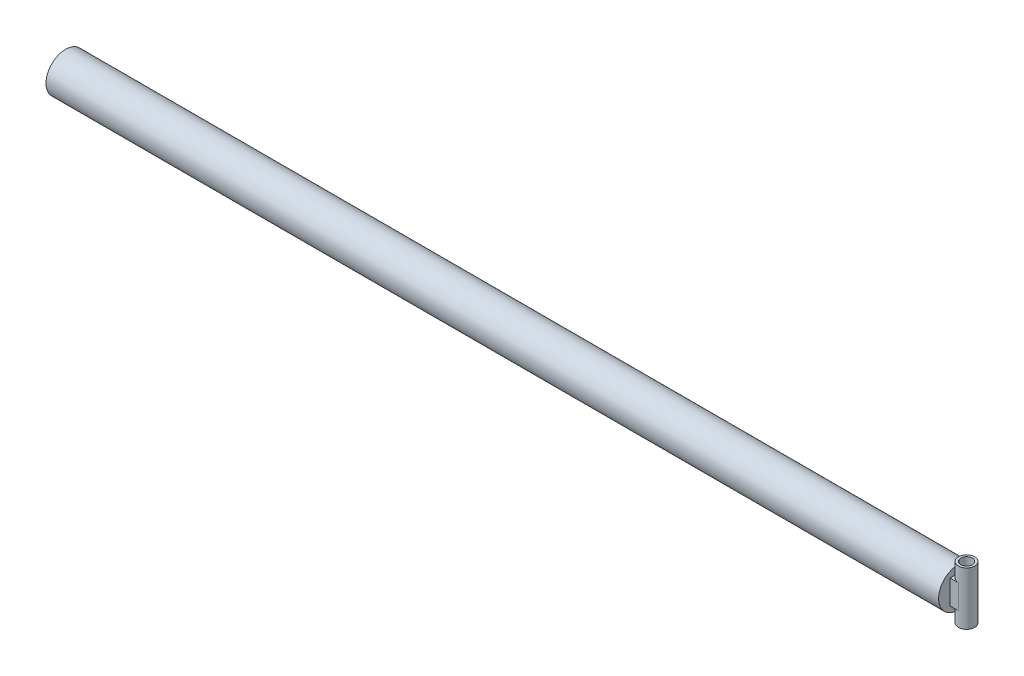
ISO-10303-21;
HEADER;
FILE_DESCRIPTION(('STEP AP214'),'2;1');
FILE_NAME('part.step','',(''),(''),'','','');
FILE_SCHEMA(('AUTOMOTIVE_DESIGN { 1 0 10303 214 1 1 1 1 }'));
ENDSEC;
DATA;
#1=APPLICATION_CONTEXT('core data for automotive mechanical design processes');
#2=APPLICATION_PROTOCOL_DEFINITION('international standard','automotive_design',2000,#1);
#3=PRODUCT_CONTEXT('',#1,'mechanical');
#4=PRODUCT('Part','Part','',(#3));
#5=PRODUCT_RELATED_PRODUCT_CATEGORY('part','',(#4));
#6=PRODUCT_DEFINITION_FORMATION('','',#4);
#7=PRODUCT_DEFINITION_CONTEXT('part definition',#1,'design');
#8=PRODUCT_DEFINITION('design','',#6,#7);
#9=PRODUCT_DEFINITION_SHAPE('','',#8);
#10=(LENGTH_UNIT() NAMED_UNIT(*) SI_UNIT(.MILLI.,.METRE.));
#11=(NAMED_UNIT(*) PLANE_ANGLE_UNIT() SI_UNIT($,.RADIAN.));
#12=(NAMED_UNIT(*) SI_UNIT($,.STERADIAN.) SOLID_ANGLE_UNIT());
#13=UNCERTAINTY_MEASURE_WITH_UNIT(LENGTH_MEASURE(1.E-05),#10,'distance_accuracy_value','');
#14=(GEOMETRIC_REPRESENTATION_CONTEXT(3) GLOBAL_UNCERTAINTY_ASSIGNED_CONTEXT((#13)) GLOBAL_UNIT_ASSIGNED_CONTEXT((#10,
#11,#12)) REPRESENTATION_CONTEXT('',''));
#15=CARTESIAN_POINT('',(0.,0.,0.));
#16=DIRECTION('',(0.,0.,1.));
#17=DIRECTION('',(1.,0.,0.));
#18=AXIS2_PLACEMENT_3D('',#15,#16,#17);
#19=CARTESIAN_POINT('',(1930.,0.,0.));
#20=DIRECTION('',(-1.,0.,0.));
#21=DIRECTION('',(0.,0.,1.));
#22=AXIS2_PLACEMENT_3D('',#19,#20,#21);
#23=PLANE('',#22);
#24=CARTESIAN_POINT('',(1930.,0.,0.));
#25=DIRECTION('',(1.,0.,0.));
#26=DIRECTION('',(0.,0.,-1.));
#27=AXIS2_PLACEMENT_3D('',#24,#25,#26);
#28=CIRCLE('',#27,84.9999999999995);
#29=CARTESIAN_POINT('',(1930.,0.,-84.9999999999995));
#30=VERTEX_POINT('',#29);
#31=EDGE_CURVE('E113',#30,#30,#28,.T.);
#32=ORIENTED_EDGE('',*,*,#31,.T.);
#33=EDGE_LOOP('',(#32));
#34=FACE_BOUND('',#33,.T.);
#35=DIRECTION('',(0.,0.,1.));
#36=VECTOR('',#35,1.);
#37=CARTESIAN_POINT('',(1930.,52.5,-35.));
#38=LINE('',#37,#36);
#39=CARTESIAN_POINT('',(1930.,52.5,-35.));
#40=VERTEX_POINT('',#39);
#41=CARTESIAN_POINT('',(1930.,52.5,35.));
#42=VERTEX_POINT('',#41);
#43=EDGE_CURVE('E61',#40,#42,#38,.T.);
#44=ORIENTED_EDGE('',*,*,#43,.F.);
#45=DIRECTION('',(0.,1.,0.));
#46=VECTOR('',#45,1.);
#47=CARTESIAN_POINT('',(1930.,52.5,-35.));
#48=LINE('',#47,#46);
#49=CARTESIAN_POINT('',(1930.,-52.5,-35.));
#50=VERTEX_POINT('',#49);
#51=EDGE_CURVE('E66',#50,#40,#48,.T.);
#52=ORIENTED_EDGE('',*,*,#51,.F.);
#53=DIRECTION('',(0.,0.,-1.));
#54=VECTOR('',#53,1.);
#55=CARTESIAN_POINT('',(1930.,-52.5,-35.));
#56=LINE('',#55,#54);
#57=CARTESIAN_POINT('',(1930.,-52.5,35.));
#58=VERTEX_POINT('',#57);
#59=EDGE_CURVE('E192',#58,#50,#56,.T.);
#60=ORIENTED_EDGE('',*,*,#59,.F.);
#61=DIRECTION('',(0.,-1.,0.));
#62=VECTOR('',#61,1.);
#63=CARTESIAN_POINT('',(1930.,52.5,35.));
#64=LINE('',#63,#62);
#65=EDGE_CURVE('E195',#42,#58,#64,.T.);
#66=ORIENTED_EDGE('',*,*,#65,.F.);
#67=EDGE_LOOP('',(#44,#52,#60,#66));
#68=FACE_BOUND('',#67,.T.);
#69=ADVANCED_FACE('F46',(#34,#68),#23,.F.);
#70=CARTESIAN_POINT('',(-1930.,0.,0.));
#71=DIRECTION('',(1.,0.,0.));
#72=DIRECTION('',(0.,0.,-1.));
#73=AXIS2_PLACEMENT_3D('',#70,#71,#72);
#74=PLANE('',#73);
#75=CARTESIAN_POINT('',(-1930.,0.,0.));
#76=DIRECTION('',(1.,0.,0.));
#77=DIRECTION('',(0.,0.,-1.));
#78=AXIS2_PLACEMENT_3D('',#75,#76,#77);
#79=CIRCLE('',#78,84.9999999999995);
#80=CARTESIAN_POINT('',(-1930.,0.,-84.9999999999995));
#81=VERTEX_POINT('',#80);
#82=EDGE_CURVE('E116',#81,#81,#79,.T.);
#83=ORIENTED_EDGE('',*,*,#82,.F.);
#84=EDGE_LOOP('',(#83));
#85=FACE_BOUND('',#84,.T.);
#86=CARTESIAN_POINT('',(-1930.,0.,0.));
#87=DIRECTION('',(-1.,0.,0.));
#88=DIRECTION('',(0.,0.,1.));
#89=AXIS2_PLACEMENT_3D('',#86,#87,#88);
#90=CIRCLE('',#89,18.75);
#91=CARTESIAN_POINT('',(-1930.,0.,18.75));
#92=VERTEX_POINT('',#91);
#93=EDGE_CURVE('E184',#92,#92,#90,.T.);
#94=ORIENTED_EDGE('',*,*,#93,.F.);
#95=EDGE_LOOP('',(#94));
#96=FACE_BOUND('',#95,.T.);
#97=ADVANCED_FACE('F48',(#85,#96),#74,.F.);
#98=CARTESIAN_POINT('',(-1930.,0.,0.));
#99=DIRECTION('',(-1.,0.,0.));
#100=DIRECTION('',(0.,0.,1.));
#101=AXIS2_PLACEMENT_3D('',#98,#99,#100);
#102=CYLINDRICAL_SURFACE('',#101,84.9999999999995);
#103=ORIENTED_EDGE('',*,*,#82,.T.);
#104=EDGE_LOOP('',(#103));
#105=FACE_BOUND('',#104,.T.);
#106=ORIENTED_EDGE('',*,*,#31,.F.);
#107=EDGE_LOOP('',(#106));
#108=FACE_BOUND('',#107,.T.);
#109=ADVANCED_FACE('F152',(#105,#108),#102,.T.);
#110=CARTESIAN_POINT('',(2001.002,52.5,35.));
#111=DIRECTION('',(0.,0.,-1.));
#112=DIRECTION('',(-1.,0.,0.));
#113=AXIS2_PLACEMENT_3D('',#110,#111,#112);
#114=PLANE('',#113);
#115=DIRECTION('',(-1.,0.,0.));
#116=VECTOR('',#115,1.);
#117=CARTESIAN_POINT('',(2001.002,-52.5,35.));
#118=LINE('',#117,#116);
#119=CARTESIAN_POINT('',(1966.,-52.5,35.));
#120=VERTEX_POINT('',#119);
#121=EDGE_CURVE('E202',#120,#58,#118,.T.);
#122=ORIENTED_EDGE('',*,*,#121,.F.);
#123=DIRECTION('',(0.,1.,0.));
#124=VECTOR('',#123,1.);
#125=CARTESIAN_POINT('',(1966.,-115.,34.9999999999995));
#126=LINE('',#125,#124);
#127=CARTESIAN_POINT('',(1966.,52.5,35.));
#128=VERTEX_POINT('',#127);
#129=EDGE_CURVE('E101',#120,#128,#126,.T.);
#130=ORIENTED_EDGE('',*,*,#129,.T.);
#131=DIRECTION('',(-1.,0.,0.));
#132=VECTOR('',#131,1.);
#133=CARTESIAN_POINT('',(2001.002,52.5,35.));
#134=LINE('',#133,#132);
#135=EDGE_CURVE('E98',#128,#42,#134,.T.);
#136=ORIENTED_EDGE('',*,*,#135,.T.);
#137=ORIENTED_EDGE('',*,*,#65,.T.);
#138=EDGE_LOOP('',(#122,#130,#136,#137));
#139=FACE_BOUND('',#138,.T.);
#140=ADVANCED_FACE('F157',(#139),#114,.F.);
#141=CARTESIAN_POINT('',(2001.002,52.5,-35.));
#142=DIRECTION('',(0.,-1.,0.));
#143=DIRECTION('',(0.,0.,-1.));
#144=AXIS2_PLACEMENT_3D('',#141,#142,#143);
#145=PLANE('',#144);
#146=ORIENTED_EDGE('',*,*,#135,.F.);
#147=CARTESIAN_POINT('',(1966.,52.5,0.));
#148=DIRECTION('',(0.,-1.,0.));
#149=DIRECTION('',(0.,0.,-1.));
#150=AXIS2_PLACEMENT_3D('',#147,#148,#149);
#151=CIRCLE('',#150,34.9999999999989);
#152=CARTESIAN_POINT('',(1966.,52.5,-34.9999999999995));
#153=VERTEX_POINT('',#152);
#154=EDGE_CURVE('E95',#128,#153,#151,.T.);
#155=ORIENTED_EDGE('',*,*,#154,.T.);
#156=DIRECTION('',(-1.,0.,0.));
#157=VECTOR('',#156,1.);
#158=CARTESIAN_POINT('',(2001.002,52.5,-35.));
#159=LINE('',#158,#157);
#160=EDGE_CURVE('E84',#153,#40,#159,.T.);
#161=ORIENTED_EDGE('',*,*,#160,.T.);
#162=ORIENTED_EDGE('',*,*,#43,.T.);
#163=EDGE_LOOP('',(#146,#155,#161,#162));
#164=FACE_BOUND('',#163,.T.);
#165=ADVANCED_FACE('F96',(#164),#145,.F.);
#166=CARTESIAN_POINT('',(2001.002,-52.5,-35.));
#167=DIRECTION('',(0.,1.,0.));
#168=DIRECTION('',(0.,0.,1.));
#169=AXIS2_PLACEMENT_3D('',#166,#167,#168);
#170=PLANE('',#169);
#171=DIRECTION('',(-1.,0.,0.));
#172=VECTOR('',#171,1.);
#173=CARTESIAN_POINT('',(2001.002,-52.5,-35.));
#174=LINE('',#173,#172);
#175=CARTESIAN_POINT('',(1966.,-52.5,-35.));
#176=VERTEX_POINT('',#175);
#177=EDGE_CURVE('E91',#176,#50,#174,.T.);
#178=ORIENTED_EDGE('',*,*,#177,.F.);
#179=CARTESIAN_POINT('',(1966.,-52.5,0.));
#180=DIRECTION('',(0.,1.,0.));
#181=DIRECTION('',(0.,0.,1.));
#182=AXIS2_PLACEMENT_3D('',#179,#180,#181);
#183=CIRCLE('',#182,34.9999999999989);
#184=EDGE_CURVE('E105',#176,#120,#183,.T.);
#185=ORIENTED_EDGE('',*,*,#184,.T.);
#186=ORIENTED_EDGE('',*,*,#121,.T.);
#187=ORIENTED_EDGE('',*,*,#59,.T.);
#188=EDGE_LOOP('',(#178,#185,#186,#187));
#189=FACE_BOUND('',#188,.T.);
#190=ADVANCED_FACE('F207',(#189),#170,.F.);
#191=CARTESIAN_POINT('',(2001.002,52.5,-35.));
#192=DIRECTION('',(0.,0.,1.));
#193=DIRECTION('',(1.,0.,0.));
#194=AXIS2_PLACEMENT_3D('',#191,#192,#193);
#195=PLANE('',#194);
#196=DIRECTION('',(0.,1.,0.));
#197=VECTOR('',#196,1.);
#198=CARTESIAN_POINT('',(1966.,-115.,-34.9999999999995));
#199=LINE('',#198,#197);
#200=EDGE_CURVE('E88',#176,#153,#199,.T.);
#201=ORIENTED_EDGE('',*,*,#200,.F.);
#202=ORIENTED_EDGE('',*,*,#177,.T.);
#203=ORIENTED_EDGE('',*,*,#51,.T.);
#204=ORIENTED_EDGE('',*,*,#160,.F.);
#205=EDGE_LOOP('',(#201,#202,#203,#204));
#206=FACE_BOUND('',#205,.T.);
#207=ADVANCED_FACE('F86',(#206),#195,.F.);
#208=CARTESIAN_POINT('',(1966.,-115.,0.));
#209=DIRECTION('',(0.,1.,0.));
#210=DIRECTION('',(0.,0.,1.));
#211=AXIS2_PLACEMENT_3D('',#208,#209,#210);
#212=CYLINDRICAL_SURFACE('',#211,34.9999999999989);
#213=CARTESIAN_POINT('',(1966.,115.,0.));
#214=DIRECTION('',(0.,1.,0.));
#215=DIRECTION('',(0.,0.,1.));
#216=AXIS2_PLACEMENT_3D('',#213,#214,#215);
#217=CIRCLE('',#216,34.9999999999989);
#218=CARTESIAN_POINT('',(1966.,115.,34.9999999999989));
#219=VERTEX_POINT('',#218);
#220=EDGE_CURVE('E181',#219,#219,#217,.T.);
#221=ORIENTED_EDGE('',*,*,#220,.F.);
#222=EDGE_LOOP('',(#221));
#223=FACE_BOUND('',#222,.T.);
#224=CARTESIAN_POINT('',(1966.,-115.,0.));
#225=DIRECTION('',(0.,1.,0.));
#226=DIRECTION('',(0.,0.,1.));
#227=AXIS2_PLACEMENT_3D('',#224,#225,#226);
#228=CIRCLE('',#227,34.9999999999989);
#229=CARTESIAN_POINT('',(1966.,-115.,34.9999999999989));
#230=VERTEX_POINT('',#229);
#231=EDGE_CURVE('E106',#230,#230,#228,.T.);
#232=ORIENTED_EDGE('',*,*,#231,.T.);
#233=EDGE_LOOP('',(#232));
#234=FACE_BOUND('',#233,.T.);
#235=ORIENTED_EDGE('',*,*,#129,.F.);
#236=ORIENTED_EDGE('',*,*,#184,.F.);
#237=ORIENTED_EDGE('',*,*,#200,.T.);
#238=ORIENTED_EDGE('',*,*,#154,.F.);
#239=EDGE_LOOP('',(#235,#236,#237,#238));
#240=FACE_BOUND('',#239,.T.);
#241=ADVANCED_FACE('F104',(#223,#234,#240),#212,.T.);
#242=CARTESIAN_POINT('',(1966.,-115.,0.));
#243=DIRECTION('',(0.,1.,0.));
#244=DIRECTION('',(0.,0.,1.));
#245=AXIS2_PLACEMENT_3D('',#242,#243,#244);
#246=PLANE('',#245);
#247=CARTESIAN_POINT('',(1966.,-115.,0.));
#248=DIRECTION('',(0.,1.,0.));
#249=DIRECTION('',(0.,0.,1.));
#250=AXIS2_PLACEMENT_3D('',#247,#248,#249);
#251=CIRCLE('',#250,25.);
#252=CARTESIAN_POINT('',(1966.,-115.,25.));
#253=VERTEX_POINT('',#252);
#254=EDGE_CURVE('E109',#253,#253,#251,.T.);
#255=ORIENTED_EDGE('',*,*,#254,.T.);
#256=EDGE_LOOP('',(#255));
#257=FACE_BOUND('',#256,.T.);
#258=ORIENTED_EDGE('',*,*,#231,.F.);
#259=EDGE_LOOP('',(#258));
#260=FACE_BOUND('',#259,.T.);
#261=ADVANCED_FACE('F246',(#257,#260),#246,.F.);
#262=CARTESIAN_POINT('',(1966.,-115.,0.));
#263=DIRECTION('',(0.,1.,0.));
#264=DIRECTION('',(0.,0.,1.));
#265=AXIS2_PLACEMENT_3D('',#262,#263,#264);
#266=CYLINDRICAL_SURFACE('',#265,25.);
#267=ORIENTED_EDGE('',*,*,#254,.F.);
#268=EDGE_LOOP('',(#267));
#269=FACE_BOUND('',#268,.T.);
#270=CARTESIAN_POINT('',(1966.,115.,0.));
#271=DIRECTION('',(0.,1.,0.));
#272=DIRECTION('',(0.,0.,1.));
#273=AXIS2_PLACEMENT_3D('',#270,#271,#272);
#274=CIRCLE('',#273,25.);
#275=CARTESIAN_POINT('',(1966.,115.,25.));
#276=VERTEX_POINT('',#275);
#277=EDGE_CURVE('E177',#276,#276,#274,.T.);
#278=ORIENTED_EDGE('',*,*,#277,.T.);
#279=EDGE_LOOP('',(#278));
#280=FACE_BOUND('',#279,.T.);
#281=ADVANCED_FACE('F243',(#269,#280),#266,.F.);
#282=CARTESIAN_POINT('',(1966.,115.,0.));
#283=DIRECTION('',(0.,1.,0.));
#284=DIRECTION('',(0.,0.,1.));
#285=AXIS2_PLACEMENT_3D('',#282,#283,#284);
#286=PLANE('',#285);
#287=ORIENTED_EDGE('',*,*,#220,.T.);
#288=EDGE_LOOP('',(#287));
#289=FACE_BOUND('',#288,.T.);
#290=ORIENTED_EDGE('',*,*,#277,.F.);
#291=EDGE_LOOP('',(#290));
#292=FACE_BOUND('',#291,.T.);
#293=ADVANCED_FACE('F235',(#289,#292),#286,.T.);
#294=CARTESIAN_POINT('',(-1920.,0.,0.));
#295=DIRECTION('',(-1.,0.,0.));
#296=DIRECTION('',(0.,0.,1.));
#297=AXIS2_PLACEMENT_3D('',#294,#295,#296);
#298=PLANE('',#297);
#299=CARTESIAN_POINT('',(-1920.,0.,0.));
#300=DIRECTION('',(-1.,0.,0.));
#301=DIRECTION('',(0.,0.,1.));
#302=AXIS2_PLACEMENT_3D('',#299,#300,#301);
#303=CIRCLE('',#302,18.75);
#304=CARTESIAN_POINT('',(-1920.,0.,18.75));
#305=VERTEX_POINT('',#304);
#306=EDGE_CURVE('E178',#305,#305,#303,.T.);
#307=ORIENTED_EDGE('',*,*,#306,.T.);
#308=EDGE_LOOP('',(#307));
#309=FACE_BOUND('',#308,.T.);
#310=CARTESIAN_POINT('',(-1920.,0.,0.));
#311=DIRECTION('',(-1.,0.,0.));
#312=DIRECTION('',(0.,0.,1.));
#313=AXIS2_PLACEMENT_3D('',#310,#311,#312);
#314=CIRCLE('',#313,64.9999999999998);
#315=CARTESIAN_POINT('',(-1920.,0.,64.9999999999998));
#316=VERTEX_POINT('',#315);
#317=EDGE_CURVE('E175',#316,#316,#314,.T.);
#318=ORIENTED_EDGE('',*,*,#317,.F.);
#319=EDGE_LOOP('',(#318));
#320=FACE_BOUND('',#319,.T.);
#321=ADVANCED_FACE('F228',(#309,#320),#298,.F.);
#322=CARTESIAN_POINT('',(-1920.,0.,0.));
#323=DIRECTION('',(-1.,0.,0.));
#324=DIRECTION('',(0.,0.,1.));
#325=AXIS2_PLACEMENT_3D('',#322,#323,#324);
#326=CYLINDRICAL_SURFACE('',#325,18.75);
#327=ORIENTED_EDGE('',*,*,#306,.F.);
#328=EDGE_LOOP('',(#327));
#329=FACE_BOUND('',#328,.T.);
#330=ORIENTED_EDGE('',*,*,#93,.T.);
#331=EDGE_LOOP('',(#330));
#332=FACE_BOUND('',#331,.T.);
#333=ADVANCED_FACE('F223',(#329,#332),#326,.F.);
#334=CARTESIAN_POINT('',(1920.,0.,0.));
#335=DIRECTION('',(-1.,0.,0.));
#336=DIRECTION('',(0.,0.,1.));
#337=AXIS2_PLACEMENT_3D('',#334,#335,#336);
#338=PLANE('',#337);
#339=CARTESIAN_POINT('',(1920.,0.,0.));
#340=DIRECTION('',(-1.,0.,0.));
#341=DIRECTION('',(0.,0.,1.));
#342=AXIS2_PLACEMENT_3D('',#339,#340,#341);
#343=CIRCLE('',#342,65.);
#344=CARTESIAN_POINT('',(1920.,0.,65.));
#345=VERTEX_POINT('',#344);
#346=EDGE_CURVE('E13',#345,#345,#343,.T.);
#347=ORIENTED_EDGE('',*,*,#346,.T.);
#348=EDGE_LOOP('',(#347));
#349=FACE_BOUND('',#348,.T.);
#350=ADVANCED_FACE('F145',(#349),#338,.T.);
#351=CARTESIAN_POINT('',(-1930.,0.,0.));
#352=DIRECTION('',(-1.,0.,0.));
#353=DIRECTION('',(0.,0.,1.));
#354=AXIS2_PLACEMENT_3D('',#351,#352,#353);
#355=CYLINDRICAL_SURFACE('',#354,65.);
#356=CARTESIAN_POINT('',(1890.,0.,0.));
#357=DIRECTION('',(-1.,0.,0.));
#358=DIRECTION('',(0.,0.,1.));
#359=AXIS2_PLACEMENT_3D('',#356,#357,#358);
#360=CIRCLE('',#359,65.);
#361=CARTESIAN_POINT('',(1890.,0.,65.));
#362=VERTEX_POINT('',#361);
#363=EDGE_CURVE('E54',#362,#362,#360,.T.);
#364=ORIENTED_EDGE('',*,*,#363,.T.);
#365=EDGE_LOOP('',(#364));
#366=FACE_BOUND('',#365,.T.);
#367=ORIENTED_EDGE('',*,*,#346,.F.);
#368=EDGE_LOOP('',(#367));
#369=FACE_BOUND('',#368,.T.);
#370=ADVANCED_FACE('F130',(#366,#369),#355,.F.);
#371=CARTESIAN_POINT('',(1890.,0.,0.));
#372=DIRECTION('',(-1.,0.,0.));
#373=DIRECTION('',(0.,0.,1.));
#374=AXIS2_PLACEMENT_3D('',#371,#372,#373);
#375=PLANE('',#374);
#376=CARTESIAN_POINT('',(1890.,0.,0.));
#377=DIRECTION('',(-1.,0.,0.));
#378=DIRECTION('',(0.,0.,1.));
#379=AXIS2_PLACEMENT_3D('',#376,#377,#378);
#380=CIRCLE('',#379,74.9999999999995);
#381=CARTESIAN_POINT('',(1890.,0.,74.9999999999995));
#382=VERTEX_POINT('',#381);
#383=EDGE_CURVE('E125',#382,#382,#380,.T.);
#384=ORIENTED_EDGE('',*,*,#383,.T.);
#385=EDGE_LOOP('',(#384));
#386=FACE_BOUND('',#385,.T.);
#387=ORIENTED_EDGE('',*,*,#363,.F.);
#388=EDGE_LOOP('',(#387));
#389=FACE_BOUND('',#388,.T.);
#390=ADVANCED_FACE('F133',(#386,#389),#375,.T.);
#391=CARTESIAN_POINT('',(-1930.,0.,0.));
#392=DIRECTION('',(-1.,0.,0.));
#393=DIRECTION('',(0.,0.,1.));
#394=AXIS2_PLACEMENT_3D('',#391,#392,#393);
#395=CYLINDRICAL_SURFACE('',#394,74.9999999999995);
#396=CARTESIAN_POINT('',(-1890.,0.,0.));
#397=DIRECTION('',(1.,0.,0.));
#398=DIRECTION('',(0.,0.,-1.));
#399=AXIS2_PLACEMENT_3D('',#396,#397,#398);
#400=CIRCLE('',#399,74.9999999999995);
#401=CARTESIAN_POINT('',(-1890.,0.,-74.9999999999995));
#402=VERTEX_POINT('',#401);
#403=EDGE_CURVE('E122',#402,#402,#400,.F.);
#404=ORIENTED_EDGE('',*,*,#403,.T.);
#405=EDGE_LOOP('',(#404));
#406=FACE_BOUND('',#405,.T.);
#407=ORIENTED_EDGE('',*,*,#383,.F.);
#408=EDGE_LOOP('',(#407));
#409=FACE_BOUND('',#408,.T.);
#410=ADVANCED_FACE('F135',(#406,#409),#395,.F.);
#411=CARTESIAN_POINT('',(-1890.,0.,0.));
#412=DIRECTION('',(1.,0.,0.));
#413=DIRECTION('',(0.,0.,-1.));
#414=AXIS2_PLACEMENT_3D('',#411,#412,#413);
#415=PLANE('',#414);
#416=CARTESIAN_POINT('',(-1890.,0.,0.));
#417=DIRECTION('',(1.,0.,0.));
#418=DIRECTION('',(0.,0.,-1.));
#419=AXIS2_PLACEMENT_3D('',#416,#417,#418);
#420=CIRCLE('',#419,65.);
#421=CARTESIAN_POINT('',(-1890.,0.,-65.));
#422=VERTEX_POINT('',#421);
#423=EDGE_CURVE('E119',#422,#422,#420,.F.);
#424=ORIENTED_EDGE('',*,*,#423,.T.);
#425=EDGE_LOOP('',(#424));
#426=FACE_BOUND('',#425,.T.);
#427=ORIENTED_EDGE('',*,*,#403,.F.);
#428=EDGE_LOOP('',(#427));
#429=FACE_BOUND('',#428,.T.);
#430=ADVANCED_FACE('F142',(#426,#429),#415,.T.);
#431=CARTESIAN_POINT('',(-1930.,0.,0.));
#432=DIRECTION('',(-1.,0.,0.));
#433=DIRECTION('',(0.,0.,1.));
#434=AXIS2_PLACEMENT_3D('',#431,#432,#433);
#435=CYLINDRICAL_SURFACE('',#434,65.);
#436=ORIENTED_EDGE('',*,*,#423,.F.);
#437=EDGE_LOOP('',(#436));
#438=FACE_BOUND('',#437,.T.);
#439=ORIENTED_EDGE('',*,*,#317,.T.);
#440=EDGE_LOOP('',(#439));
#441=FACE_BOUND('',#440,.T.);
#442=ADVANCED_FACE('F160',(#438,#441),#435,.F.);
#443=CLOSED_SHELL('',(#69,#97,#109,#140,#165,#190,#207,#241,#261,#281,#293,#321,#333,#350,#370,
#390,#410,#430,#442));
#444=MANIFOLD_SOLID_BREP('B2',#443);
#445=ADVANCED_BREP_SHAPE_REPRESENTATION('',(#18,#444),#14);
#446=SHAPE_DEFINITION_REPRESENTATION(#9,#445);
ENDSEC;
END-ISO-10303-21;
